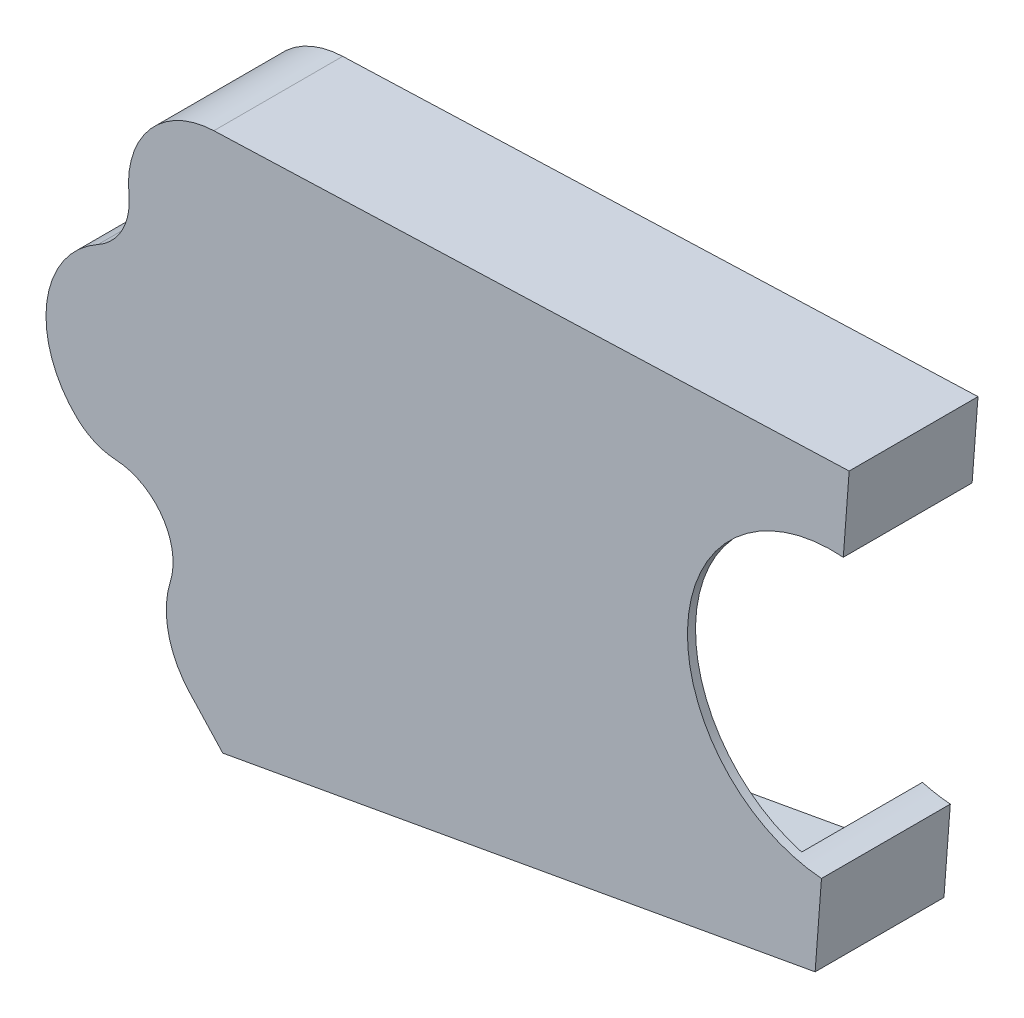
ISO-10303-21;
HEADER;
FILE_DESCRIPTION(('STEP AP214'),'2;1');
FILE_NAME('part.step','',(''),(''),'','','');
FILE_SCHEMA(('AUTOMOTIVE_DESIGN { 1 0 10303 214 1 1 1 1 }'));
ENDSEC;
DATA;
#1=APPLICATION_CONTEXT('core data for automotive mechanical design processes');
#2=APPLICATION_PROTOCOL_DEFINITION('international standard','automotive_design',2000,#1);
#3=PRODUCT_CONTEXT('',#1,'mechanical');
#4=PRODUCT('Part','Part','',(#3));
#5=PRODUCT_RELATED_PRODUCT_CATEGORY('part','',(#4));
#6=PRODUCT_DEFINITION_FORMATION('','',#4);
#7=PRODUCT_DEFINITION_CONTEXT('part definition',#1,'design');
#8=PRODUCT_DEFINITION('design','',#6,#7);
#9=PRODUCT_DEFINITION_SHAPE('','',#8);
#10=(LENGTH_UNIT() NAMED_UNIT(*) SI_UNIT(.MILLI.,.METRE.));
#11=(NAMED_UNIT(*) PLANE_ANGLE_UNIT() SI_UNIT($,.RADIAN.));
#12=(NAMED_UNIT(*) SI_UNIT($,.STERADIAN.) SOLID_ANGLE_UNIT());
#13=UNCERTAINTY_MEASURE_WITH_UNIT(LENGTH_MEASURE(1.E-05),#10,'distance_accuracy_value','');
#14=(GEOMETRIC_REPRESENTATION_CONTEXT(3) GLOBAL_UNCERTAINTY_ASSIGNED_CONTEXT((#13)) GLOBAL_UNIT_ASSIGNED_CONTEXT((#10,
#11,#12)) REPRESENTATION_CONTEXT('',''));
#15=CARTESIAN_POINT('',(0.,0.,0.));
#16=DIRECTION('',(0.,0.,1.));
#17=DIRECTION('',(1.,0.,0.));
#18=AXIS2_PLACEMENT_3D('',#15,#16,#17);
#19=CARTESIAN_POINT('',(-137.200361795676,-18.5,30.));
#20=DIRECTION('',(0.,0.,-1.));
#21=DIRECTION('',(-1.,0.,0.));
#22=AXIS2_PLACEMENT_3D('',#19,#20,#21);
#23=CYLINDRICAL_SURFACE('',#22,8.00000000000004);
#24=CARTESIAN_POINT('',(-137.200361795676,-18.5,0.));
#25=DIRECTION('',(0.,0.,1.));
#26=DIRECTION('',(1.,0.,0.));
#27=AXIS2_PLACEMENT_3D('',#24,#25,#26);
#28=CIRCLE('',#27,8.00000000000004);
#29=CARTESIAN_POINT('',(-142.71636152929,-24.2942857142857,0.));
#30=VERTEX_POINT('',#29);
#31=CARTESIAN_POINT('',(-137.611022999845,-26.4894528833576,0.));
#32=VERTEX_POINT('',#31);
#33=EDGE_CURVE('E199',#30,#32,#28,.T.);
#34=ORIENTED_EDGE('',*,*,#33,.F.);
#35=DIRECTION('',(0.,0.,-1.));
#36=VECTOR('',#35,1.);
#37=CARTESIAN_POINT('',(-142.71636152929,-24.2942857142857,30.));
#38=LINE('',#37,#36);
#39=CARTESIAN_POINT('',(-142.71636152929,-24.2942857142857,30.));
#40=VERTEX_POINT('',#39);
#41=EDGE_CURVE('E11',#40,#30,#38,.T.);
#42=ORIENTED_EDGE('',*,*,#41,.F.);
#43=CARTESIAN_POINT('',(-137.200361795676,-18.5,30.));
#44=DIRECTION('',(0.,0.,1.));
#45=DIRECTION('',(1.,0.,0.));
#46=AXIS2_PLACEMENT_3D('',#43,#44,#45);
#47=CIRCLE('',#46,8.00000000000004);
#48=CARTESIAN_POINT('',(-137.611022999845,-26.4894528833576,30.));
#49=VERTEX_POINT('',#48);
#50=EDGE_CURVE('E264',#40,#49,#47,.T.);
#51=ORIENTED_EDGE('',*,*,#50,.T.);
#52=DIRECTION('',(0.,0.,-1.));
#53=VECTOR('',#52,1.);
#54=CARTESIAN_POINT('',(-137.611022999845,-26.4894528833576,30.));
#55=LINE('',#54,#53);
#56=EDGE_CURVE('E133',#49,#32,#55,.T.);
#57=ORIENTED_EDGE('',*,*,#56,.T.);
#58=EDGE_LOOP('',(#34,#42,#51,#57));
#59=FACE_BOUND('',#58,.T.);
#60=ADVANCED_FACE('F35',(#59),#23,.F.);
#61=CARTESIAN_POINT('',(-130.305362128659,-11.2571428571429,30.));
#62=DIRECTION('',(0.,0.,-1.));
#63=DIRECTION('',(-1.,0.,0.));
#64=AXIS2_PLACEMENT_3D('',#61,#62,#63);
#65=CYLINDRICAL_SURFACE('',#64,18.);
#66=CARTESIAN_POINT('',(-130.305362128659,-11.2571428571429,0.));
#67=DIRECTION('',(0.,0.,1.));
#68=DIRECTION('',(1.,0.,0.));
#69=AXIS2_PLACEMENT_3D('',#66,#67,#68);
#70=CIRCLE('',#69,18.);
#71=CARTESIAN_POINT('',(-139.001078611089,4.50307652131727,0.));
#72=VERTEX_POINT('',#71);
#73=EDGE_CURVE('E202',#72,#30,#70,.T.);
#74=ORIENTED_EDGE('',*,*,#73,.F.);
#75=DIRECTION('',(0.,0.,-1.));
#76=VECTOR('',#75,1.);
#77=CARTESIAN_POINT('',(-139.001078611089,4.50307652131727,30.));
#78=LINE('',#77,#76);
#79=CARTESIAN_POINT('',(-139.001078611089,4.50307652131727,30.));
#80=VERTEX_POINT('',#79);
#81=EDGE_CURVE('E43',#80,#72,#78,.T.);
#82=ORIENTED_EDGE('',*,*,#81,.F.);
#83=CARTESIAN_POINT('',(-130.305362128659,-11.2571428571429,30.));
#84=DIRECTION('',(0.,0.,1.));
#85=DIRECTION('',(1.,0.,0.));
#86=AXIS2_PLACEMENT_3D('',#83,#84,#85);
#87=CIRCLE('',#86,18.);
#88=EDGE_CURVE('E319',#80,#40,#87,.T.);
#89=ORIENTED_EDGE('',*,*,#88,.T.);
#90=ORIENTED_EDGE('',*,*,#41,.T.);
#91=EDGE_LOOP('',(#74,#82,#89,#90));
#92=FACE_BOUND('',#91,.T.);
#93=ADVANCED_FACE('F318',(#92),#65,.F.);
#94=CARTESIAN_POINT('',(-149.62917653406,23.7655668727686,30.));
#95=DIRECTION('',(0.,0.,-1.));
#96=DIRECTION('',(-1.,0.,0.));
#97=AXIS2_PLACEMENT_3D('',#94,#95,#96);
#98=CYLINDRICAL_SURFACE('',#97,22.);
#99=CARTESIAN_POINT('',(-149.62917653406,23.7655668727686,0.));
#100=DIRECTION('',(0.,0.,1.));
#101=DIRECTION('',(1.,0.,0.));
#102=AXIS2_PLACEMENT_3D('',#99,#100,#101);
#103=CIRCLE('',#102,22.);
#104=CARTESIAN_POINT('',(-127.741520279456,25.9860406240953,0.));
#105=VERTEX_POINT('',#104);
#106=EDGE_CURVE('E206',#72,#105,#103,.T.);
#107=ORIENTED_EDGE('',*,*,#106,.T.);
#108=DIRECTION('',(0.,0.,-1.));
#109=VECTOR('',#108,1.);
#110=CARTESIAN_POINT('',(-127.741520279456,25.9860406240953,30.));
#111=LINE('',#110,#109);
#112=CARTESIAN_POINT('',(-127.741520279456,25.9860406240953,30.));
#113=VERTEX_POINT('',#112);
#114=EDGE_CURVE('E305',#113,#105,#111,.T.);
#115=ORIENTED_EDGE('',*,*,#114,.F.);
#116=CARTESIAN_POINT('',(-149.62917653406,23.7655668727686,30.));
#117=DIRECTION('',(0.,0.,1.));
#118=DIRECTION('',(1.,0.,0.));
#119=AXIS2_PLACEMENT_3D('',#116,#117,#118);
#120=CIRCLE('',#119,22.);
#121=EDGE_CURVE('E311',#80,#113,#120,.T.);
#122=ORIENTED_EDGE('',*,*,#121,.F.);
#123=ORIENTED_EDGE('',*,*,#81,.T.);
#124=EDGE_LOOP('',(#107,#115,#122,#123));
#125=FACE_BOUND('',#124,.T.);
#126=ADVANCED_FACE('F309',(#125),#98,.T.);
#127=CARTESIAN_POINT('',(-112.818118287682,27.5,30.));
#128=DIRECTION('',(0.,0.,-1.));
#129=DIRECTION('',(-1.,0.,0.));
#130=AXIS2_PLACEMENT_3D('',#127,#128,#129);
#131=CYLINDRICAL_SURFACE('',#130,15.);
#132=CARTESIAN_POINT('',(-112.818118287682,27.5,0.));
#133=DIRECTION('',(0.,0.,1.));
#134=DIRECTION('',(1.,0.,0.));
#135=AXIS2_PLACEMENT_3D('',#132,#133,#134);
#136=CIRCLE('',#135,15.);
#137=CARTESIAN_POINT('',(-113.359672518482,42.4902207793982,0.));
#138=VERTEX_POINT('',#137);
#139=EDGE_CURVE('E209',#138,#105,#136,.T.);
#140=ORIENTED_EDGE('',*,*,#139,.F.);
#141=DIRECTION('',(0.,0.,-1.));
#142=VECTOR('',#141,1.);
#143=CARTESIAN_POINT('',(-113.359672518482,42.4902207793982,30.));
#144=LINE('',#143,#142);
#145=CARTESIAN_POINT('',(-113.359672518482,42.4902207793982,30.));
#146=VERTEX_POINT('',#145);
#147=EDGE_CURVE('E303',#146,#138,#144,.T.);
#148=ORIENTED_EDGE('',*,*,#147,.F.);
#149=CARTESIAN_POINT('',(-112.818118287682,27.5,30.));
#150=DIRECTION('',(0.,0.,1.));
#151=DIRECTION('',(1.,0.,0.));
#152=AXIS2_PLACEMENT_3D('',#149,#150,#151);
#153=CIRCLE('',#152,15.);
#154=EDGE_CURVE('E376',#146,#113,#153,.T.);
#155=ORIENTED_EDGE('',*,*,#154,.T.);
#156=ORIENTED_EDGE('',*,*,#114,.T.);
#157=EDGE_LOOP('',(#140,#148,#155,#156));
#158=FACE_BOUND('',#157,.T.);
#159=ADVANCED_FACE('F439',(#158),#131,.F.);
#160=CARTESIAN_POINT('',(-1.6808115181259,46.5248618000884,30.));
#161=DIRECTION('',(0.0361036153867233,-0.99934805195988,0.));
#162=DIRECTION('',(0.99934805195988,0.0361036153867233,0.));
#163=AXIS2_PLACEMENT_3D('',#160,#161,#162);
#164=PLANE('',#163);
#165=DIRECTION('',(-0.99934805195988,-0.0361036153867233,0.));
#166=VECTOR('',#165,1.);
#167=CARTESIAN_POINT('',(-1.6808115181259,46.5248618000884,0.));
#168=LINE('',#167,#166);
#169=CARTESIAN_POINT('',(36.6151256440785,47.9083855718782,0.));
#170=VERTEX_POINT('',#169);
#171=EDGE_CURVE('E212',#170,#138,#168,.T.);
#172=ORIENTED_EDGE('',*,*,#171,.F.);
#173=DIRECTION('',(0.,0.,-1.));
#174=VECTOR('',#173,1.);
#175=CARTESIAN_POINT('',(36.6151256440785,47.9083855718782,30.));
#176=LINE('',#175,#174);
#177=CARTESIAN_POINT('',(36.6151256440785,47.9083855718782,30.));
#178=VERTEX_POINT('',#177);
#179=EDGE_CURVE('E301',#178,#170,#176,.T.);
#180=ORIENTED_EDGE('',*,*,#179,.F.);
#181=DIRECTION('',(-0.99934805195988,-0.0361036153867233,0.));
#182=VECTOR('',#181,1.);
#183=CARTESIAN_POINT('',(-1.6808115181259,46.5248618000884,30.));
#184=LINE('',#183,#182);
#185=EDGE_CURVE('E379',#178,#146,#184,.T.);
#186=ORIENTED_EDGE('',*,*,#185,.T.);
#187=ORIENTED_EDGE('',*,*,#147,.T.);
#188=EDGE_LOOP('',(#172,#180,#186,#187));
#189=FACE_BOUND('',#188,.T.);
#190=ADVANCED_FACE('F444',(#189),#164,.T.);
#191=CARTESIAN_POINT('',(32.8108087885257,-2.47734263946603,30.));
#192=DIRECTION('',(0.997161713430863,-0.075289556165686,0.));
#193=DIRECTION('',(0.075289556165686,0.997161713430863,0.));
#194=AXIS2_PLACEMENT_3D('',#191,#192,#193);
#195=PLANE('',#194);
#196=DIRECTION('',(-0.075289556165686,-0.997161713430863,0.));
#197=VECTOR('',#196,1.);
#198=CARTESIAN_POINT('',(32.8108087885257,-2.47734263946603,0.));
#199=LINE('',#198,#197);
#200=CARTESIAN_POINT('',(35.6963418803418,35.7396859702502,0.));
#201=VERTEX_POINT('',#200);
#202=EDGE_CURVE('E215',#170,#201,#199,.T.);
#203=ORIENTED_EDGE('',*,*,#202,.T.);
#204=DIRECTION('',(0.,0.,-1.));
#205=VECTOR('',#204,1.);
#206=CARTESIAN_POINT('',(35.6963418803418,35.7396859702502,30.));
#207=LINE('',#206,#205);
#208=CARTESIAN_POINT('',(35.6963418803418,35.7396859702502,30.));
#209=VERTEX_POINT('',#208);
#210=EDGE_CURVE('E299',#209,#201,#207,.T.);
#211=ORIENTED_EDGE('',*,*,#210,.F.);
#212=DIRECTION('',(-0.075289556165686,-0.997161713430863,0.));
#213=VECTOR('',#212,1.);
#214=CARTESIAN_POINT('',(32.8108087885257,-2.47734263946603,30.));
#215=LINE('',#214,#213);
#216=EDGE_CURVE('E191',#178,#209,#215,.T.);
#217=ORIENTED_EDGE('',*,*,#216,.F.);
#218=ORIENTED_EDGE('',*,*,#179,.T.);
#219=EDGE_LOOP('',(#203,#211,#217,#218));
#220=FACE_BOUND('',#219,.T.);
#221=ADVANCED_FACE('F387',(#220),#195,.F.);
#222=CARTESIAN_POINT('',(39.7909407825417,-3.00436953262585,30.));
#223=DIRECTION('',(0.997161713430863,-0.0752895561656862,0.));
#224=DIRECTION('',(0.0752895561656862,0.997161713430863,0.));
#225=AXIS2_PLACEMENT_3D('',#222,#223,#224);
#226=PLANE('',#225);
#227=DIRECTION('',(-0.0752895561656862,-0.997161713430863,0.));
#228=VECTOR('',#227,1.);
#229=CARTESIAN_POINT('',(39.7909407825417,-3.00436953262585,0.));
#230=LINE('',#229,#228);
#231=CARTESIAN_POINT('',(44.1845694820255,55.1864147577585,0.));
#232=VERTEX_POINT('',#231);
#233=CARTESIAN_POINT('',(42.7282062946577,35.8978216878582,0.));
#234=VERTEX_POINT('',#233);
#235=EDGE_CURVE('E221',#232,#234,#230,.T.);
#236=ORIENTED_EDGE('',*,*,#235,.F.);
#237=DIRECTION('',(0.,0.,-1.));
#238=VECTOR('',#237,1.);
#239=CARTESIAN_POINT('',(44.1845694820255,55.1864147577585,30.));
#240=LINE('',#239,#238);
#241=CARTESIAN_POINT('',(44.1845694820255,55.1864147577585,32.));
#242=VERTEX_POINT('',#241);
#243=EDGE_CURVE('E295',#242,#232,#240,.T.);
#244=ORIENTED_EDGE('',*,*,#243,.F.);
#245=DIRECTION('',(0.0752895561656862,0.997161713430863,0.));
#246=VECTOR('',#245,1.);
#247=CARTESIAN_POINT('',(39.7909407825417,-3.00436953262585,32.));
#248=LINE('',#247,#246);
#249=CARTESIAN_POINT('',(42.7282062946577,35.8978216878582,32.));
#250=VERTEX_POINT('',#249);
#251=EDGE_CURVE('E399',#250,#242,#248,.T.);
#252=ORIENTED_EDGE('',*,*,#251,.F.);
#253=DIRECTION('',(0.,0.,-1.));
#254=VECTOR('',#253,1.);
#255=CARTESIAN_POINT('',(42.7282062946577,35.8978216878582,30.));
#256=LINE('',#255,#254);
#257=EDGE_CURVE('E297',#250,#234,#256,.T.);
#258=ORIENTED_EDGE('',*,*,#257,.T.);
#259=EDGE_LOOP('',(#236,#244,#252,#258));
#260=FACE_BOUND('',#259,.T.);
#261=ADVANCED_FACE('F394',(#260),#226,.T.);
#262=CARTESIAN_POINT('',(-1.93353682583296,53.5202981638076,30.));
#263=DIRECTION('',(0.0361036153867233,-0.99934805195988,0.));
#264=DIRECTION('',(0.99934805195988,0.0361036153867233,0.));
#265=AXIS2_PLACEMENT_3D('',#262,#263,#264);
#266=PLANE('',#265);
#267=DIRECTION('',(-0.99934805195988,-0.0361036153867233,0.));
#268=VECTOR('',#267,1.);
#269=CARTESIAN_POINT('',(-1.93353682583296,53.5202981638076,0.));
#270=LINE('',#269,#268);
#271=CARTESIAN_POINT('',(-113.61239782619,49.4856571431173,0.));
#272=VERTEX_POINT('',#271);
#273=EDGE_CURVE('E224',#232,#272,#270,.T.);
#274=ORIENTED_EDGE('',*,*,#273,.T.);
#275=DIRECTION('',(0.,0.,-1.));
#276=VECTOR('',#275,1.);
#277=CARTESIAN_POINT('',(-113.61239782619,49.4856571431173,30.));
#278=LINE('',#277,#276);
#279=CARTESIAN_POINT('',(-113.61239782619,49.4856571431173,32.));
#280=VERTEX_POINT('',#279);
#281=EDGE_CURVE('E292',#280,#272,#278,.T.);
#282=ORIENTED_EDGE('',*,*,#281,.F.);
#283=DIRECTION('',(-0.99934805195988,-0.0361036153867233,0.));
#284=VECTOR('',#283,1.);
#285=CARTESIAN_POINT('',(-1.93353682583296,53.5202981638076,32.));
#286=LINE('',#285,#284);
#287=EDGE_CURVE('E766',#242,#280,#286,.T.);
#288=ORIENTED_EDGE('',*,*,#287,.F.);
#289=ORIENTED_EDGE('',*,*,#243,.T.);
#290=EDGE_LOOP('',(#274,#282,#288,#289));
#291=FACE_BOUND('',#290,.T.);
#292=ADVANCED_FACE('F453',(#291),#266,.F.);
#293=CARTESIAN_POINT('',(-112.818118287682,27.5,30.));
#294=DIRECTION('',(0.,0.,-1.));
#295=DIRECTION('',(-1.,0.,0.));
#296=AXIS2_PLACEMENT_3D('',#293,#294,#295);
#297=CYLINDRICAL_SURFACE('',#296,22.);
#298=CARTESIAN_POINT('',(-112.818118287682,27.5,0.));
#299=DIRECTION('',(0.,0.,1.));
#300=DIRECTION('',(1.,0.,0.));
#301=AXIS2_PLACEMENT_3D('',#298,#299,#300);
#302=CIRCLE('',#301,22.);
#303=CARTESIAN_POINT('',(-134.705774542285,25.2795262486732,0.));
#304=VERTEX_POINT('',#303);
#305=EDGE_CURVE('E226',#272,#304,#302,.T.);
#306=ORIENTED_EDGE('',*,*,#305,.T.);
#307=DIRECTION('',(0.,0.,-1.));
#308=VECTOR('',#307,1.);
#309=CARTESIAN_POINT('',(-134.705774542285,25.2795262486732,30.));
#310=LINE('',#309,#308);
#311=CARTESIAN_POINT('',(-134.705774542285,25.2795262486732,32.));
#312=VERTEX_POINT('',#311);
#313=EDGE_CURVE('E290',#312,#304,#310,.T.);
#314=ORIENTED_EDGE('',*,*,#313,.F.);
#315=CARTESIAN_POINT('',(-112.818118287682,27.5,32.));
#316=DIRECTION('',(0.,0.,1.));
#317=DIRECTION('',(1.,0.,0.));
#318=AXIS2_PLACEMENT_3D('',#315,#316,#317);
#319=CIRCLE('',#318,22.);
#320=EDGE_CURVE('E763',#280,#312,#319,.T.);
#321=ORIENTED_EDGE('',*,*,#320,.F.);
#322=ORIENTED_EDGE('',*,*,#281,.T.);
#323=EDGE_LOOP('',(#306,#314,#321,#322));
#324=FACE_BOUND('',#323,.T.);
#325=ADVANCED_FACE('F456',(#324),#297,.T.);
#326=CARTESIAN_POINT('',(-149.62917653406,23.7655668727686,30.));
#327=DIRECTION('',(0.,0.,-1.));
#328=DIRECTION('',(-1.,0.,0.));
#329=AXIS2_PLACEMENT_3D('',#326,#327,#328);
#330=CYLINDRICAL_SURFACE('',#329,15.);
#331=CARTESIAN_POINT('',(-149.62917653406,23.7655668727686,0.));
#332=DIRECTION('',(0.,0.,1.));
#333=DIRECTION('',(1.,0.,0.));
#334=AXIS2_PLACEMENT_3D('',#331,#332,#333);
#335=CIRCLE('',#334,15.);
#336=CARTESIAN_POINT('',(-142.382746132034,10.6320507240518,0.));
#337=VERTEX_POINT('',#336);
#338=EDGE_CURVE('E229',#337,#304,#335,.T.);
#339=ORIENTED_EDGE('',*,*,#338,.F.);
#340=DIRECTION('',(0.,0.,-1.));
#341=VECTOR('',#340,1.);
#342=CARTESIAN_POINT('',(-142.382746132034,10.6320507240518,30.));
#343=LINE('',#342,#341);
#344=CARTESIAN_POINT('',(-142.382746132034,10.6320507240518,32.));
#345=VERTEX_POINT('',#344);
#346=EDGE_CURVE('E288',#345,#337,#343,.T.);
#347=ORIENTED_EDGE('',*,*,#346,.F.);
#348=CARTESIAN_POINT('',(-149.62917653406,23.7655668727686,32.));
#349=DIRECTION('',(0.,0.,1.));
#350=DIRECTION('',(1.,0.,0.));
#351=AXIS2_PLACEMENT_3D('',#348,#349,#350);
#352=CIRCLE('',#351,15.);
#353=EDGE_CURVE('E760',#312,#345,#352,.F.);
#354=ORIENTED_EDGE('',*,*,#353,.F.);
#355=ORIENTED_EDGE('',*,*,#313,.T.);
#356=EDGE_LOOP('',(#339,#347,#354,#355));
#357=FACE_BOUND('',#356,.T.);
#358=ADVANCED_FACE('F460',(#357),#330,.F.);
#359=CARTESIAN_POINT('',(-130.305362128659,-11.2571428571429,30.));
#360=DIRECTION('',(0.,0.,-1.));
#361=DIRECTION('',(-1.,0.,0.));
#362=AXIS2_PLACEMENT_3D('',#359,#360,#361);
#363=CYLINDRICAL_SURFACE('',#362,25.);
#364=CARTESIAN_POINT('',(-130.305362128659,-11.2571428571429,0.));
#365=DIRECTION('',(0.,0.,1.));
#366=DIRECTION('',(1.,0.,0.));
#367=AXIS2_PLACEMENT_3D('',#364,#365,#366);
#368=CIRCLE('',#367,25.);
#369=CARTESIAN_POINT('',(-147.542861296201,-29.3642857142857,0.));
#370=VERTEX_POINT('',#369);
#371=EDGE_CURVE('E232',#337,#370,#368,.T.);
#372=ORIENTED_EDGE('',*,*,#371,.T.);
#373=DIRECTION('',(0.,0.,-1.));
#374=VECTOR('',#373,1.);
#375=CARTESIAN_POINT('',(-147.542861296201,-29.3642857142857,30.));
#376=LINE('',#375,#374);
#377=CARTESIAN_POINT('',(-147.542861296201,-29.3642857142857,32.));
#378=VERTEX_POINT('',#377);
#379=EDGE_CURVE('E285',#378,#370,#376,.T.);
#380=ORIENTED_EDGE('',*,*,#379,.F.);
#381=CARTESIAN_POINT('',(-130.305362128659,-11.2571428571429,32.));
#382=DIRECTION('',(0.,0.,1.));
#383=DIRECTION('',(1.,0.,0.));
#384=AXIS2_PLACEMENT_3D('',#381,#382,#383);
#385=CIRCLE('',#384,25.);
#386=EDGE_CURVE('E773',#345,#378,#385,.T.);
#387=ORIENTED_EDGE('',*,*,#386,.F.);
#388=ORIENTED_EDGE('',*,*,#346,.T.);
#389=EDGE_LOOP('',(#372,#380,#387,#388));
#390=FACE_BOUND('',#389,.T.);
#391=ADVANCED_FACE('F464',(#390),#363,.T.);
#392=CARTESIAN_POINT('',(-137.200361795676,-18.5,30.));
#393=DIRECTION('',(0.,0.,-1.));
#394=DIRECTION('',(-1.,0.,0.));
#395=AXIS2_PLACEMENT_3D('',#392,#393,#394);
#396=CYLINDRICAL_SURFACE('',#395,15.);
#397=CARTESIAN_POINT('',(-137.200361795676,-18.5,0.));
#398=DIRECTION('',(0.,0.,1.));
#399=DIRECTION('',(1.,0.,0.));
#400=AXIS2_PLACEMENT_3D('',#397,#398,#399);
#401=CIRCLE('',#400,15.);
#402=CARTESIAN_POINT('',(-137.970351553493,-33.4802241562955,0.));
#403=VERTEX_POINT('',#402);
#404=EDGE_CURVE('E234',#370,#403,#401,.T.);
#405=ORIENTED_EDGE('',*,*,#404,.T.);
#406=DIRECTION('',(0.,0.,-1.));
#407=VECTOR('',#406,1.);
#408=CARTESIAN_POINT('',(-137.970351553493,-33.4802241562955,30.));
#409=LINE('',#408,#407);
#410=CARTESIAN_POINT('',(-137.970351553493,-33.4802241562955,32.));
#411=VERTEX_POINT('',#410);
#412=EDGE_CURVE('E283',#411,#403,#409,.T.);
#413=ORIENTED_EDGE('',*,*,#412,.F.);
#414=CARTESIAN_POINT('',(-137.200361795676,-18.5,32.));
#415=DIRECTION('',(0.,0.,1.));
#416=DIRECTION('',(1.,0.,0.));
#417=AXIS2_PLACEMENT_3D('',#414,#415,#416);
#418=CIRCLE('',#417,15.);
#419=EDGE_CURVE('E776',#378,#411,#418,.T.);
#420=ORIENTED_EDGE('',*,*,#419,.F.);
#421=ORIENTED_EDGE('',*,*,#379,.T.);
#422=EDGE_LOOP('',(#405,#413,#420,#421));
#423=FACE_BOUND('',#422,.T.);
#424=ADVANCED_FACE('F468',(#423),#396,.T.);
#425=CARTESIAN_POINT('',(-138.740341311309,-48.4604483125909,30.));
#426=DIRECTION('',(0.,0.,-1.));
#427=DIRECTION('',(-1.,0.,0.));
#428=AXIS2_PLACEMENT_3D('',#425,#426,#427);
#429=CYLINDRICAL_SURFACE('',#428,15.);
#430=CARTESIAN_POINT('',(-138.740341311309,-48.4604483125909,0.));
#431=DIRECTION('',(0.,0.,1.));
#432=DIRECTION('',(1.,0.,0.));
#433=AXIS2_PLACEMENT_3D('',#430,#431,#432);
#434=CIRCLE('',#433,15.);
#435=CARTESIAN_POINT('',(-124.422839539333,-52.9336063703251,0.));
#436=VERTEX_POINT('',#435);
#437=EDGE_CURVE('E237',#436,#403,#434,.T.);
#438=ORIENTED_EDGE('',*,*,#437,.F.);
#439=DIRECTION('',(0.,0.,-1.));
#440=VECTOR('',#439,1.);
#441=CARTESIAN_POINT('',(-124.422839539333,-52.9336063703251,30.));
#442=LINE('',#441,#440);
#443=CARTESIAN_POINT('',(-124.422839539333,-52.9336063703251,32.));
#444=VERTEX_POINT('',#443);
#445=EDGE_CURVE('E281',#444,#436,#442,.T.);
#446=ORIENTED_EDGE('',*,*,#445,.F.);
#447=CARTESIAN_POINT('',(-138.740341311309,-48.4604483125909,32.));
#448=DIRECTION('',(0.,0.,1.));
#449=DIRECTION('',(1.,0.,0.));
#450=AXIS2_PLACEMENT_3D('',#447,#448,#449);
#451=CIRCLE('',#450,15.);
#452=EDGE_CURVE('E366',#411,#444,#451,.F.);
#453=ORIENTED_EDGE('',*,*,#452,.F.);
#454=ORIENTED_EDGE('',*,*,#412,.T.);
#455=EDGE_LOOP('',(#438,#446,#453,#454));
#456=FACE_BOUND('',#455,.T.);
#457=ADVANCED_FACE('F472',(#456),#429,.F.);
#458=CARTESIAN_POINT('',(-103.423836940436,-59.4942381883351,30.));
#459=DIRECTION('',(0.,0.,-1.));
#460=DIRECTION('',(-1.,0.,0.));
#461=AXIS2_PLACEMENT_3D('',#458,#459,#460);
#462=CYLINDRICAL_SURFACE('',#461,22.);
#463=CARTESIAN_POINT('',(-103.423836940436,-59.4942381883351,0.));
#464=DIRECTION('',(0.,0.,1.));
#465=DIRECTION('',(1.,0.,0.));
#466=AXIS2_PLACEMENT_3D('',#463,#464,#465);
#467=CIRCLE('',#466,22.);
#468=CARTESIAN_POINT('',(-119.594822483379,-74.4106461530536,0.));
#469=VERTEX_POINT('',#468);
#470=EDGE_CURVE('E240',#436,#469,#467,.T.);
#471=ORIENTED_EDGE('',*,*,#470,.T.);
#472=DIRECTION('',(0.,0.,-1.));
#473=VECTOR('',#472,1.);
#474=CARTESIAN_POINT('',(-119.594822483379,-74.4106461530536,30.));
#475=LINE('',#474,#473);
#476=CARTESIAN_POINT('',(-119.594822483379,-74.4106461530536,32.));
#477=VERTEX_POINT('',#476);
#478=EDGE_CURVE('E278',#477,#469,#475,.T.);
#479=ORIENTED_EDGE('',*,*,#478,.F.);
#480=CARTESIAN_POINT('',(-103.423836940436,-59.4942381883351,32.));
#481=DIRECTION('',(0.,0.,1.));
#482=DIRECTION('',(1.,0.,0.));
#483=AXIS2_PLACEMENT_3D('',#480,#481,#482);
#484=CIRCLE('',#483,22.);
#485=EDGE_CURVE('E363',#444,#477,#484,.T.);
#486=ORIENTED_EDGE('',*,*,#485,.F.);
#487=ORIENTED_EDGE('',*,*,#445,.T.);
#488=EDGE_LOOP('',(#471,#479,#486,#487));
#489=FACE_BOUND('',#488,.T.);
#490=ADVANCED_FACE('F476',(#489),#462,.T.);
#491=CARTESIAN_POINT('',(-101.700320400968,-93.8102050252219,30.));
#492=DIRECTION('',(0.735044797406518,0.678018543850839,0.));
#493=DIRECTION('',(-0.678018543850839,0.735044797406518,0.));
#494=AXIS2_PLACEMENT_3D('',#491,#492,#493);
#495=PLANE('',#494);
#496=DIRECTION('',(0.678018543850839,-0.735044797406517,0.));
#497=VECTOR('',#496,1.);
#498=CARTESIAN_POINT('',(-101.700320400968,-93.8102050252219,0.));
#499=LINE('',#498,#497);
#500=CARTESIAN_POINT('',(-111.407238252728,-83.2868653164508,0.));
#501=VERTEX_POINT('',#500);
#502=EDGE_CURVE('E242',#469,#501,#499,.T.);
#503=ORIENTED_EDGE('',*,*,#502,.T.);
#504=DIRECTION('',(0.,0.,-1.));
#505=VECTOR('',#504,1.);
#506=CARTESIAN_POINT('',(-111.407238252728,-83.2868653164508,30.));
#507=LINE('',#506,#505);
#508=CARTESIAN_POINT('',(-111.407238252728,-83.2868653164508,32.));
#509=VERTEX_POINT('',#508);
#510=EDGE_CURVE('E275',#509,#501,#507,.T.);
#511=ORIENTED_EDGE('',*,*,#510,.F.);
#512=DIRECTION('',(0.678018543850839,-0.735044797406518,0.));
#513=VECTOR('',#512,1.);
#514=CARTESIAN_POINT('',(-101.700320400968,-93.8102050252219,32.));
#515=LINE('',#514,#513);
#516=EDGE_CURVE('E356',#477,#509,#515,.T.);
#517=ORIENTED_EDGE('',*,*,#516,.F.);
#518=ORIENTED_EDGE('',*,*,#478,.T.);
#519=EDGE_LOOP('',(#503,#511,#517,#518));
#520=FACE_BOUND('',#519,.T.);
#521=ADVANCED_FACE('F354',(#520),#495,.F.);
#522=CARTESIAN_POINT('',(11.0314039097203,-61.2267257344286,30.));
#523=DIRECTION('',(-0.177317927557775,0.98415362244246,0.));
#524=DIRECTION('',(-0.98415362244246,-0.177317927557775,0.));
#525=AXIS2_PLACEMENT_3D('',#522,#523,#524);
#526=PLANE('',#525);
#527=DIRECTION('',(0.98415362244246,0.177317927557775,0.));
#528=VECTOR('',#527,1.);
#529=CARTESIAN_POINT('',(11.0314039097203,-61.2267257344286,0.));
#530=LINE('',#529,#528);
#531=CARTESIAN_POINT('',(35.7309347183833,-56.7765367448559,0.));
#532=VERTEX_POINT('',#531);
#533=EDGE_CURVE('E244',#501,#532,#530,.T.);
#534=ORIENTED_EDGE('',*,*,#533,.T.);
#535=DIRECTION('',(0.,0.,-1.));
#536=VECTOR('',#535,1.);
#537=CARTESIAN_POINT('',(35.7309347183833,-56.7765367448559,30.));
#538=LINE('',#537,#536);
#539=CARTESIAN_POINT('',(35.7309347183833,-56.7765367448559,32.));
#540=VERTEX_POINT('',#539);
#541=EDGE_CURVE('E273',#540,#532,#538,.T.);
#542=ORIENTED_EDGE('',*,*,#541,.F.);
#543=DIRECTION('',(0.98415362244246,0.177317927557775,0.));
#544=VECTOR('',#543,1.);
#545=CARTESIAN_POINT('',(11.0314039097203,-61.2267257344286,32.));
#546=LINE('',#545,#544);
#547=EDGE_CURVE('E350',#509,#540,#546,.T.);
#548=ORIENTED_EDGE('',*,*,#547,.F.);
#549=ORIENTED_EDGE('',*,*,#510,.T.);
#550=EDGE_LOOP('',(#534,#542,#548,#549));
#551=FACE_BOUND('',#550,.T.);
#552=ADVANCED_FACE('F344',(#551),#526,.F.);
#553=CARTESIAN_POINT('',(39.7909407825417,-3.00436953262585,30.));
#554=DIRECTION('',(0.997161713430863,-0.0752895561656862,0.));
#555=DIRECTION('',(0.0752895561656862,0.997161713430863,0.));
#556=AXIS2_PLACEMENT_3D('',#553,#554,#555);
#557=PLANE('',#556);
#558=DIRECTION('',(-0.0752895561656862,-0.997161713430863,0.));
#559=VECTOR('',#558,1.);
#560=CARTESIAN_POINT('',(39.7909407825417,-3.00436953262585,0.));
#561=LINE('',#560,#559);
#562=CARTESIAN_POINT('',(37.3073582500718,-35.8978216878584,0.));
#563=VERTEX_POINT('',#562);
#564=EDGE_CURVE('E247',#563,#532,#561,.T.);
#565=ORIENTED_EDGE('',*,*,#564,.F.);
#566=DIRECTION('',(0.,0.,-1.));
#567=VECTOR('',#566,1.);
#568=CARTESIAN_POINT('',(37.3073582500718,-35.8978216878584,30.));
#569=LINE('',#568,#567);
#570=CARTESIAN_POINT('',(37.3073582500718,-35.8978216878584,32.));
#571=VERTEX_POINT('',#570);
#572=EDGE_CURVE('E271',#571,#563,#569,.T.);
#573=ORIENTED_EDGE('',*,*,#572,.F.);
#574=DIRECTION('',(0.0752895561656862,0.997161713430863,0.));
#575=VECTOR('',#574,1.);
#576=CARTESIAN_POINT('',(39.7909407825417,-3.00436953262585,32.));
#577=LINE('',#576,#575);
#578=EDGE_CURVE('E203',#540,#571,#577,.T.);
#579=ORIENTED_EDGE('',*,*,#578,.F.);
#580=ORIENTED_EDGE('',*,*,#541,.T.);
#581=EDGE_LOOP('',(#565,#573,#579,#580));
#582=FACE_BOUND('',#581,.T.);
#583=ADVANCED_FACE('F338',(#582),#557,.T.);
#584=CARTESIAN_POINT('',(40.0177822723635,0.,30.));
#585=DIRECTION('',(0.,0.,-1.));
#586=DIRECTION('',(-1.,0.,0.));
#587=AXIS2_PLACEMENT_3D('',#584,#585,#586);
#588=CYLINDRICAL_SURFACE('',#587,36.0000000043596);
#589=CARTESIAN_POINT('',(40.0177822723635,0.,0.));
#590=DIRECTION('',(0.,0.,1.));
#591=DIRECTION('',(1.,0.,0.));
#592=AXIS2_PLACEMENT_3D('',#589,#590,#591);
#593=CIRCLE('',#592,36.0000000043596);
#594=CARTESIAN_POINT('',(30.3789586763555,-34.6856321839307,0.));
#595=VERTEX_POINT('',#594);
#596=EDGE_CURVE('E250',#595,#563,#593,.T.);
#597=ORIENTED_EDGE('',*,*,#596,.F.);
#598=DIRECTION('',(0.,0.,-1.));
#599=VECTOR('',#598,1.);
#600=CARTESIAN_POINT('',(30.3789586763555,-34.6856321839307,30.));
#601=LINE('',#600,#599);
#602=CARTESIAN_POINT('',(30.3789586763555,-34.6856321839307,30.));
#603=VERTEX_POINT('',#602);
#604=EDGE_CURVE('E269',#603,#595,#601,.T.);
#605=ORIENTED_EDGE('',*,*,#604,.F.);
#606=CARTESIAN_POINT('',(40.0177822723635,0.,30.));
#607=DIRECTION('',(0.,0.,1.));
#608=DIRECTION('',(1.,0.,0.));
#609=AXIS2_PLACEMENT_3D('',#606,#607,#608);
#610=CIRCLE('',#609,36.0000000043596);
#611=EDGE_CURVE('E371',#209,#603,#610,.T.);
#612=ORIENTED_EDGE('',*,*,#611,.F.);
#613=ORIENTED_EDGE('',*,*,#210,.T.);
#614=CARTESIAN_POINT('',(40.0177822723635,0.,0.));
#615=DIRECTION('',(0.,0.,1.));
#616=DIRECTION('',(1.,0.,0.));
#617=AXIS2_PLACEMENT_3D('',#614,#615,#616);
#618=CIRCLE('',#617,36.0000000043596);
#619=EDGE_CURVE('E218',#234,#201,#618,.T.);
#620=ORIENTED_EDGE('',*,*,#619,.F.);
#621=ORIENTED_EDGE('',*,*,#257,.F.);
#622=CARTESIAN_POINT('',(40.0177822723635,0.,32.));
#623=DIRECTION('',(0.,0.,1.));
#624=DIRECTION('',(1.,0.,0.));
#625=AXIS2_PLACEMENT_3D('',#622,#623,#624);
#626=CIRCLE('',#625,36.0000000043596);
#627=EDGE_CURVE('E334',#250,#571,#626,.T.);
#628=ORIENTED_EDGE('',*,*,#627,.T.);
#629=ORIENTED_EDGE('',*,*,#572,.T.);
#630=EDGE_LOOP('',(#597,#605,#612,#613,#620,#621,#628,#629));
#631=FACE_BOUND('',#630,.T.);
#632=ADVANCED_FACE('F326',(#631),#588,.F.);
#633=CARTESIAN_POINT('',(32.8108087885257,-2.47734263946603,30.));
#634=DIRECTION('',(0.997161713430863,-0.075289556165686,0.));
#635=DIRECTION('',(0.075289556165686,0.997161713430863,0.));
#636=AXIS2_PLACEMENT_3D('',#633,#634,#635);
#637=PLANE('',#636);
#638=DIRECTION('',(-0.075289556165686,-0.997161713430863,0.));
#639=VECTOR('',#638,1.);
#640=CARTESIAN_POINT('',(32.8108087885257,-2.47734263946603,0.));
#641=LINE('',#640,#639);
#642=CARTESIAN_POINT('',(29.1586393427622,-50.8479763335077,0.));
#643=VERTEX_POINT('',#642);
#644=EDGE_CURVE('E253',#595,#643,#641,.T.);
#645=ORIENTED_EDGE('',*,*,#644,.T.);
#646=DIRECTION('',(0.,0.,-1.));
#647=VECTOR('',#646,1.);
#648=CARTESIAN_POINT('',(29.1586393427622,-50.8479763335077,30.));
#649=LINE('',#648,#647);
#650=CARTESIAN_POINT('',(29.1586393427622,-50.8479763335077,30.));
#651=VERTEX_POINT('',#650);
#652=EDGE_CURVE('E175',#651,#643,#649,.T.);
#653=ORIENTED_EDGE('',*,*,#652,.F.);
#654=DIRECTION('',(-0.075289556165686,-0.997161713430863,0.));
#655=VECTOR('',#654,1.);
#656=CARTESIAN_POINT('',(32.8108087885257,-2.47734263946603,30.));
#657=LINE('',#656,#655);
#658=EDGE_CURVE('E189',#603,#651,#657,.T.);
#659=ORIENTED_EDGE('',*,*,#658,.F.);
#660=ORIENTED_EDGE('',*,*,#604,.T.);
#661=EDGE_LOOP('',(#645,#653,#659,#660));
#662=FACE_BOUND('',#661,.T.);
#663=ADVANCED_FACE('F489',(#662),#637,.F.);
#664=CARTESIAN_POINT('',(9.79017841681591,-54.3376503773314,30.));
#665=DIRECTION('',(-0.177317927557775,0.98415362244246,0.));
#666=DIRECTION('',(-0.98415362244246,-0.177317927557775,0.));
#667=AXIS2_PLACEMENT_3D('',#664,#665,#666);
#668=PLANE('',#667);
#669=DIRECTION('',(0.98415362244246,0.177317927557775,0.));
#670=VECTOR('',#669,1.);
#671=CARTESIAN_POINT('',(9.79017841681591,-54.3376503773314,0.));
#672=LINE('',#671,#670);
#673=CARTESIAN_POINT('',(-108.867065107908,-75.7164839575049,0.));
#674=VERTEX_POINT('',#673);
#675=EDGE_CURVE('E171',#674,#643,#672,.T.);
#676=ORIENTED_EDGE('',*,*,#675,.F.);
#677=DIRECTION('',(0.,0.,-1.));
#678=VECTOR('',#677,1.);
#679=CARTESIAN_POINT('',(-108.867065107908,-75.7164839575049,30.));
#680=LINE('',#679,#678);
#681=CARTESIAN_POINT('',(-108.867065107908,-75.7164839575049,30.));
#682=VERTEX_POINT('',#681);
#683=EDGE_CURVE('E164',#682,#674,#680,.T.);
#684=ORIENTED_EDGE('',*,*,#683,.F.);
#685=DIRECTION('',(0.98415362244246,0.177317927557775,0.));
#686=VECTOR('',#685,1.);
#687=CARTESIAN_POINT('',(9.79017841681591,-54.3376503773314,30.));
#688=LINE('',#687,#686);
#689=EDGE_CURVE('E168',#682,#651,#688,.T.);
#690=ORIENTED_EDGE('',*,*,#689,.T.);
#691=ORIENTED_EDGE('',*,*,#652,.T.);
#692=EDGE_LOOP('',(#676,#684,#690,#691));
#693=FACE_BOUND('',#692,.T.);
#694=ADVANCED_FACE('F166',(#693),#668,.T.);
#695=CARTESIAN_POINT('',(-96.5550068191224,-89.0640752182661,30.));
#696=DIRECTION('',(0.735044797406517,0.678018543850839,0.));
#697=DIRECTION('',(-0.678018543850839,0.735044797406517,0.));
#698=AXIS2_PLACEMENT_3D('',#695,#696,#697);
#699=PLANE('',#698);
#700=DIRECTION('',(0.678018543850839,-0.735044797406517,0.));
#701=VECTOR('',#700,1.);
#702=CARTESIAN_POINT('',(-96.5550068191224,-89.0640752182661,0.));
#703=LINE('',#702,#701);
#704=CARTESIAN_POINT('',(-114.449508901533,-69.6645163460977,0.));
#705=VERTEX_POINT('',#704);
#706=EDGE_CURVE('E257',#705,#674,#703,.T.);
#707=ORIENTED_EDGE('',*,*,#706,.F.);
#708=DIRECTION('',(0.,0.,-1.));
#709=VECTOR('',#708,1.);
#710=CARTESIAN_POINT('',(-114.449508901533,-69.6645163460977,30.));
#711=LINE('',#710,#709);
#712=CARTESIAN_POINT('',(-114.449508901533,-69.6645163460977,30.));
#713=VERTEX_POINT('',#712);
#714=EDGE_CURVE('E176',#713,#705,#711,.T.);
#715=ORIENTED_EDGE('',*,*,#714,.F.);
#716=DIRECTION('',(0.678018543850839,-0.735044797406517,0.));
#717=VECTOR('',#716,1.);
#718=CARTESIAN_POINT('',(-96.5550068191224,-89.0640752182661,30.));
#719=LINE('',#718,#717);
#720=EDGE_CURVE('E179',#713,#682,#719,.T.);
#721=ORIENTED_EDGE('',*,*,#720,.T.);
#722=ORIENTED_EDGE('',*,*,#683,.T.);
#723=EDGE_LOOP('',(#707,#715,#721,#722));
#724=FACE_BOUND('',#723,.T.);
#725=ADVANCED_FACE('F180',(#724),#699,.T.);
#726=CARTESIAN_POINT('',(-103.423836940436,-59.4942381883351,30.));
#727=DIRECTION('',(0.,0.,-1.));
#728=DIRECTION('',(-1.,0.,0.));
#729=AXIS2_PLACEMENT_3D('',#726,#727,#728);
#730=CYLINDRICAL_SURFACE('',#729,15.);
#731=CARTESIAN_POINT('',(-103.423836940436,-59.4942381883351,0.));
#732=DIRECTION('',(0.,0.,1.));
#733=DIRECTION('',(1.,0.,0.));
#734=AXIS2_PLACEMENT_3D('',#731,#732,#733);
#735=CIRCLE('',#734,15.);
#736=CARTESIAN_POINT('',(-117.741338712411,-55.021080130601,0.));
#737=VERTEX_POINT('',#736);
#738=EDGE_CURVE('E259',#737,#705,#735,.T.);
#739=ORIENTED_EDGE('',*,*,#738,.F.);
#740=DIRECTION('',(0.,0.,-1.));
#741=VECTOR('',#740,1.);
#742=CARTESIAN_POINT('',(-117.741338712411,-55.021080130601,30.));
#743=LINE('',#742,#741);
#744=CARTESIAN_POINT('',(-117.741338712411,-55.021080130601,30.));
#745=VERTEX_POINT('',#744);
#746=EDGE_CURVE('E51',#745,#737,#743,.T.);
#747=ORIENTED_EDGE('',*,*,#746,.F.);
#748=CARTESIAN_POINT('',(-103.423836940436,-59.4942381883351,30.));
#749=DIRECTION('',(0.,0.,1.));
#750=DIRECTION('',(1.,0.,0.));
#751=AXIS2_PLACEMENT_3D('',#748,#749,#750);
#752=CIRCLE('',#751,15.);
#753=EDGE_CURVE('E183',#745,#713,#752,.T.);
#754=ORIENTED_EDGE('',*,*,#753,.T.);
#755=ORIENTED_EDGE('',*,*,#714,.T.);
#756=EDGE_LOOP('',(#739,#747,#754,#755));
#757=FACE_BOUND('',#756,.T.);
#758=ADVANCED_FACE('F321',(#757),#730,.F.);
#759=CARTESIAN_POINT('',(-138.740341311309,-48.4604483125909,30.));
#760=DIRECTION('',(0.,0.,-1.));
#761=DIRECTION('',(-1.,0.,0.));
#762=AXIS2_PLACEMENT_3D('',#759,#760,#761);
#763=CYLINDRICAL_SURFACE('',#762,22.);
#764=CARTESIAN_POINT('',(-138.740341311309,-48.4604483125909,0.));
#765=DIRECTION('',(0.,0.,1.));
#766=DIRECTION('',(1.,0.,0.));
#767=AXIS2_PLACEMENT_3D('',#764,#765,#766);
#768=CIRCLE('',#767,22.);
#769=EDGE_CURVE('E262',#737,#32,#768,.T.);
#770=ORIENTED_EDGE('',*,*,#769,.T.);
#771=ORIENTED_EDGE('',*,*,#56,.F.);
#772=CARTESIAN_POINT('',(-138.740341311309,-48.4604483125909,30.));
#773=DIRECTION('',(0.,0.,1.));
#774=DIRECTION('',(1.,0.,0.));
#775=AXIS2_PLACEMENT_3D('',#772,#773,#774);
#776=CIRCLE('',#775,22.);
#777=EDGE_CURVE('E196',#745,#49,#776,.T.);
#778=ORIENTED_EDGE('',*,*,#777,.F.);
#779=ORIENTED_EDGE('',*,*,#746,.T.);
#780=EDGE_LOOP('',(#770,#771,#778,#779));
#781=FACE_BOUND('',#780,.T.);
#782=ADVANCED_FACE('F423',(#781),#763,.T.);
#783=CARTESIAN_POINT('',(0.,0.,0.));
#784=DIRECTION('',(0.,0.,1.));
#785=DIRECTION('',(1.,0.,0.));
#786=AXIS2_PLACEMENT_3D('',#783,#784,#785);
#787=PLANE('',#786);
#788=ORIENTED_EDGE('',*,*,#33,.T.);
#789=ORIENTED_EDGE('',*,*,#769,.F.);
#790=ORIENTED_EDGE('',*,*,#738,.T.);
#791=ORIENTED_EDGE('',*,*,#706,.T.);
#792=ORIENTED_EDGE('',*,*,#675,.T.);
#793=ORIENTED_EDGE('',*,*,#644,.F.);
#794=ORIENTED_EDGE('',*,*,#596,.T.);
#795=ORIENTED_EDGE('',*,*,#564,.T.);
#796=ORIENTED_EDGE('',*,*,#533,.F.);
#797=ORIENTED_EDGE('',*,*,#502,.F.);
#798=ORIENTED_EDGE('',*,*,#470,.F.);
#799=ORIENTED_EDGE('',*,*,#437,.T.);
#800=ORIENTED_EDGE('',*,*,#404,.F.);
#801=ORIENTED_EDGE('',*,*,#371,.F.);
#802=ORIENTED_EDGE('',*,*,#338,.T.);
#803=ORIENTED_EDGE('',*,*,#305,.F.);
#804=ORIENTED_EDGE('',*,*,#273,.F.);
#805=ORIENTED_EDGE('',*,*,#235,.T.);
#806=ORIENTED_EDGE('',*,*,#619,.T.);
#807=ORIENTED_EDGE('',*,*,#202,.F.);
#808=ORIENTED_EDGE('',*,*,#171,.T.);
#809=ORIENTED_EDGE('',*,*,#139,.T.);
#810=ORIENTED_EDGE('',*,*,#106,.F.);
#811=ORIENTED_EDGE('',*,*,#73,.T.);
#812=EDGE_LOOP('',(#788,#789,#790,#791,#792,#793,#794,#795,#796,#797,#798,#799,#800,#801,#802,
#803,#804,#805,#806,#807,#808,#809,#810,#811));
#813=FACE_BOUND('',#812,.T.);
#814=ADVANCED_FACE('F316',(#813),#787,.F.);
#815=CARTESIAN_POINT('',(0.,0.,32.));
#816=DIRECTION('',(0.,0.,1.));
#817=DIRECTION('',(1.,0.,0.));
#818=AXIS2_PLACEMENT_3D('',#815,#816,#817);
#819=PLANE('',#818);
#820=ORIENTED_EDGE('',*,*,#627,.F.);
#821=ORIENTED_EDGE('',*,*,#251,.T.);
#822=ORIENTED_EDGE('',*,*,#287,.T.);
#823=ORIENTED_EDGE('',*,*,#320,.T.);
#824=ORIENTED_EDGE('',*,*,#353,.T.);
#825=ORIENTED_EDGE('',*,*,#386,.T.);
#826=ORIENTED_EDGE('',*,*,#419,.T.);
#827=ORIENTED_EDGE('',*,*,#452,.T.);
#828=ORIENTED_EDGE('',*,*,#485,.T.);
#829=ORIENTED_EDGE('',*,*,#516,.T.);
#830=ORIENTED_EDGE('',*,*,#547,.T.);
#831=ORIENTED_EDGE('',*,*,#578,.T.);
#832=EDGE_LOOP('',(#820,#821,#822,#823,#824,#825,#826,#827,#828,#829,#830,#831));
#833=FACE_BOUND('',#832,.T.);
#834=ADVANCED_FACE('F360',(#833),#819,.T.);
#835=CARTESIAN_POINT('',(0.,0.,30.));
#836=DIRECTION('',(0.,0.,1.));
#837=DIRECTION('',(1.,0.,0.));
#838=AXIS2_PLACEMENT_3D('',#835,#836,#837);
#839=PLANE('',#838);
#840=ORIENTED_EDGE('',*,*,#185,.F.);
#841=ORIENTED_EDGE('',*,*,#216,.T.);
#842=ORIENTED_EDGE('',*,*,#611,.T.);
#843=ORIENTED_EDGE('',*,*,#658,.T.);
#844=ORIENTED_EDGE('',*,*,#689,.F.);
#845=ORIENTED_EDGE('',*,*,#720,.F.);
#846=ORIENTED_EDGE('',*,*,#753,.F.);
#847=ORIENTED_EDGE('',*,*,#777,.T.);
#848=ORIENTED_EDGE('',*,*,#50,.F.);
#849=ORIENTED_EDGE('',*,*,#88,.F.);
#850=ORIENTED_EDGE('',*,*,#121,.T.);
#851=ORIENTED_EDGE('',*,*,#154,.F.);
#852=EDGE_LOOP('',(#840,#841,#842,#843,#844,#845,#846,#847,#848,#849,#850,#851));
#853=FACE_BOUND('',#852,.T.);
#854=ADVANCED_FACE('F186',(#853),#839,.F.);
#855=CLOSED_SHELL('',(#60,#93,#126,#159,#190,#221,#261,#292,#325,#358,#391,#424,#457,#490,#521,
#552,#583,#632,#663,#694,#725,#758,#782,#814,#834,#854));
#856=MANIFOLD_SOLID_BREP('B2',#855);
#857=ADVANCED_BREP_SHAPE_REPRESENTATION('',(#18,#856),#14);
#858=SHAPE_DEFINITION_REPRESENTATION(#9,#857);
ENDSEC;
END-ISO-10303-21;
